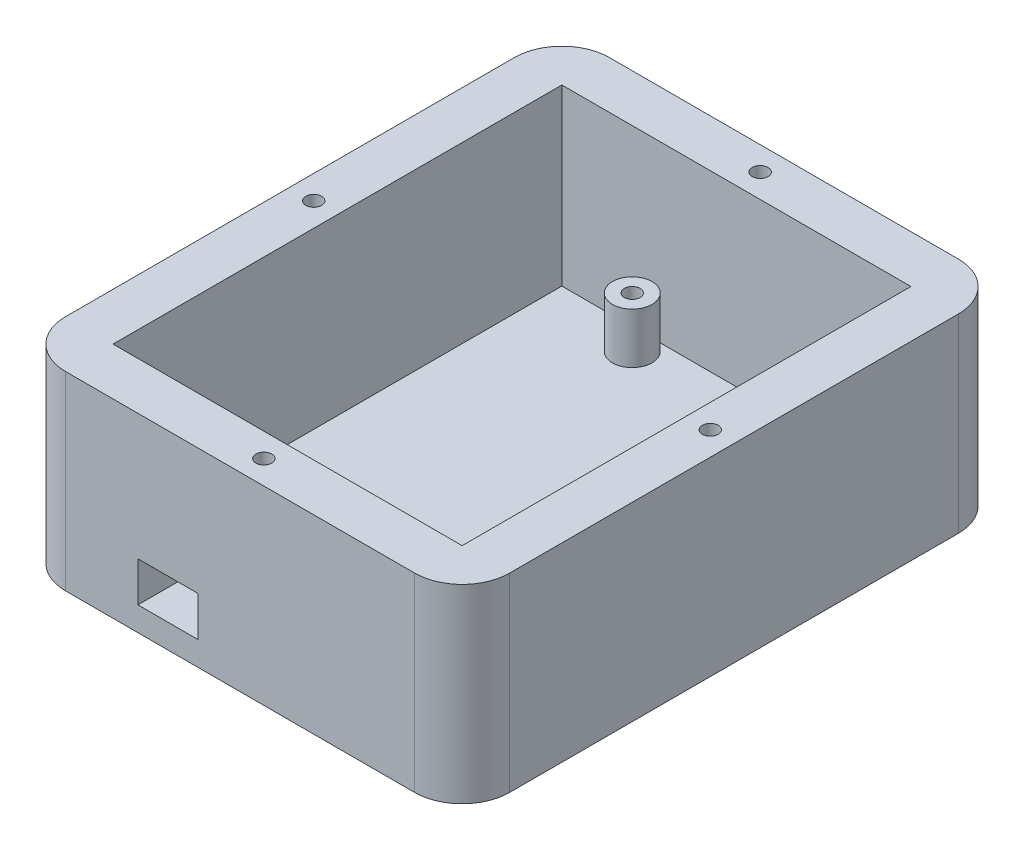
ISO-10303-21;
HEADER;
FILE_DESCRIPTION(('STEP AP214'),'2;1');
FILE_NAME('part.step','',(''),(''),'','','');
FILE_SCHEMA(('AUTOMOTIVE_DESIGN { 1 0 10303 214 1 1 1 1 }'));
ENDSEC;
DATA;
#1=APPLICATION_CONTEXT('core data for automotive mechanical design processes');
#2=APPLICATION_PROTOCOL_DEFINITION('international standard','automotive_design',2000,#1);
#3=PRODUCT_CONTEXT('',#1,'mechanical');
#4=PRODUCT('Part','Part','',(#3));
#5=PRODUCT_RELATED_PRODUCT_CATEGORY('part','',(#4));
#6=PRODUCT_DEFINITION_FORMATION('','',#4);
#7=PRODUCT_DEFINITION_CONTEXT('part definition',#1,'design');
#8=PRODUCT_DEFINITION('design','',#6,#7);
#9=PRODUCT_DEFINITION_SHAPE('','',#8);
#10=(LENGTH_UNIT() NAMED_UNIT(*) SI_UNIT(.MILLI.,.METRE.));
#11=(NAMED_UNIT(*) PLANE_ANGLE_UNIT() SI_UNIT($,.RADIAN.));
#12=(NAMED_UNIT(*) SI_UNIT($,.STERADIAN.) SOLID_ANGLE_UNIT());
#13=UNCERTAINTY_MEASURE_WITH_UNIT(LENGTH_MEASURE(1.E-05),#10,'distance_accuracy_value','');
#14=(GEOMETRIC_REPRESENTATION_CONTEXT(3) GLOBAL_UNCERTAINTY_ASSIGNED_CONTEXT((#13)) GLOBAL_UNIT_ASSIGNED_CONTEXT((#10,
#11,#12)) REPRESENTATION_CONTEXT('',''));
#15=CARTESIAN_POINT('',(0.,0.,0.));
#16=DIRECTION('',(0.,0.,1.));
#17=DIRECTION('',(1.,0.,0.));
#18=AXIS2_PLACEMENT_3D('',#15,#16,#17);
#19=CARTESIAN_POINT('',(3.175,38.1,-3.175));
#20=DIRECTION('',(0.,-1.,0.));
#21=DIRECTION('',(0.,0.,-1.));
#22=AXIS2_PLACEMENT_3D('',#19,#20,#21);
#23=PLANE('',#22);
#24=CARTESIAN_POINT('',(-1.5875,38.1,-48.175000043));
#25=DIRECTION('',(0.,1.,0.));
#26=DIRECTION('',(0.,0.,1.));
#27=AXIS2_PLACEMENT_3D('',#24,#25,#26);
#28=CIRCLE('',#27,1.5875);
#29=CARTESIAN_POINT('',(-1.5875,38.1,-46.587500043));
#30=VERTEX_POINT('',#29);
#31=EDGE_CURVE('E184',#30,#30,#28,.T.);
#32=ORIENTED_EDGE('',*,*,#31,.F.);
#33=EDGE_LOOP('',(#32));
#34=FACE_BOUND('',#33,.T.);
#35=CARTESIAN_POINT('',(38.174999977,38.1,-97.937500086));
#36=DIRECTION('',(0.,1.,0.));
#37=DIRECTION('',(0.,0.,1.));
#38=AXIS2_PLACEMENT_3D('',#35,#36,#37);
#39=CIRCLE('',#38,1.5875);
#40=CARTESIAN_POINT('',(38.174999977,38.1,-96.350000086));
#41=VERTEX_POINT('',#40);
#42=EDGE_CURVE('E190',#41,#41,#39,.T.);
#43=ORIENTED_EDGE('',*,*,#42,.F.);
#44=EDGE_LOOP('',(#43));
#45=FACE_BOUND('',#44,.T.);
#46=CARTESIAN_POINT('',(38.174999977,38.1,1.58750000000001));
#47=DIRECTION('',(0.,1.,0.));
#48=DIRECTION('',(0.,0.,-1.));
#49=AXIS2_PLACEMENT_3D('',#46,#47,#48);
#50=CIRCLE('',#49,1.5875);
#51=CARTESIAN_POINT('',(38.174999977,38.1,0.));
#52=VERTEX_POINT('',#51);
#53=EDGE_CURVE('E196',#52,#52,#50,.T.);
#54=ORIENTED_EDGE('',*,*,#53,.F.);
#55=EDGE_LOOP('',(#54));
#56=FACE_BOUND('',#55,.T.);
#57=CARTESIAN_POINT('',(77.937499954,38.1,-48.175000043));
#58=DIRECTION('',(0.,1.,0.));
#59=DIRECTION('',(0.,0.,-1.));
#60=AXIS2_PLACEMENT_3D('',#57,#58,#59);
#61=CIRCLE('',#60,1.5875);
#62=CARTESIAN_POINT('',(77.937499954,38.1,-49.762500043));
#63=VERTEX_POINT('',#62);
#64=EDGE_CURVE('E178',#63,#63,#61,.T.);
#65=ORIENTED_EDGE('',*,*,#64,.F.);
#66=EDGE_LOOP('',(#65));
#67=FACE_BOUND('',#66,.T.);
#68=DIRECTION('',(0.,0.,-1.));
#69=VECTOR('',#68,1.);
#70=CARTESIAN_POINT('',(73.174999954,38.1,-3.175));
#71=LINE('',#70,#69);
#72=CARTESIAN_POINT('',(73.174999954,38.1,-3.175));
#73=VERTEX_POINT('',#72);
#74=CARTESIAN_POINT('',(73.174999954,38.1,-93.175000086));
#75=VERTEX_POINT('',#74);
#76=EDGE_CURVE('E281',#73,#75,#71,.T.);
#77=ORIENTED_EDGE('',*,*,#76,.F.);
#78=DIRECTION('',(1.,0.,0.));
#79=VECTOR('',#78,1.);
#80=CARTESIAN_POINT('',(3.175,38.1,-3.175));
#81=LINE('',#80,#79);
#82=CARTESIAN_POINT('',(3.175,38.1,-3.175));
#83=VERTEX_POINT('',#82);
#84=EDGE_CURVE('E284',#83,#73,#81,.T.);
#85=ORIENTED_EDGE('',*,*,#84,.F.);
#86=DIRECTION('',(0.,0.,1.));
#87=VECTOR('',#86,1.);
#88=CARTESIAN_POINT('',(3.175,38.1,-93.175000086));
#89=LINE('',#88,#87);
#90=CARTESIAN_POINT('',(3.175,38.1,-93.175000086));
#91=VERTEX_POINT('',#90);
#92=EDGE_CURVE('E277',#91,#83,#89,.T.);
#93=ORIENTED_EDGE('',*,*,#92,.F.);
#94=DIRECTION('',(-1.,0.,0.));
#95=VECTOR('',#94,1.);
#96=CARTESIAN_POINT('',(73.174999954,38.1,-93.175000086));
#97=LINE('',#96,#95);
#98=EDGE_CURVE('E278',#75,#91,#97,.T.);
#99=ORIENTED_EDGE('',*,*,#98,.F.);
#100=EDGE_LOOP('',(#77,#85,#93,#99));
#101=FACE_BOUND('',#100,.T.);
#102=CARTESIAN_POINT('',(3.175,38.1,-3.175));
#103=DIRECTION('',(0.,-1.,0.));
#104=DIRECTION('',(0.,0.,-1.));
#105=AXIS2_PLACEMENT_3D('',#102,#103,#104);
#106=CIRCLE('',#105,9.525);
#107=CARTESIAN_POINT('',(-6.35,38.1,-3.17500000000007));
#108=VERTEX_POINT('',#107);
#109=CARTESIAN_POINT('',(3.17500000000007,38.1,6.35));
#110=VERTEX_POINT('',#109);
#111=EDGE_CURVE('E207',#108,#110,#106,.F.);
#112=ORIENTED_EDGE('',*,*,#111,.T.);
#113=DIRECTION('',(1.,0.,0.));
#114=VECTOR('',#113,1.);
#115=CARTESIAN_POINT('',(73.1749999539999,38.1,6.35));
#116=LINE('',#115,#114);
#117=CARTESIAN_POINT('',(73.1749999539999,38.1,6.35));
#118=VERTEX_POINT('',#117);
#119=EDGE_CURVE('E219',#110,#118,#116,.T.);
#120=ORIENTED_EDGE('',*,*,#119,.T.);
#121=CARTESIAN_POINT('',(73.174999954,38.1,-3.175));
#122=DIRECTION('',(0.,-1.,0.));
#123=DIRECTION('',(0.,0.,-1.));
#124=AXIS2_PLACEMENT_3D('',#121,#122,#123);
#125=CIRCLE('',#124,9.525);
#126=CARTESIAN_POINT('',(82.699999954,38.1,-3.17500000000003));
#127=VERTEX_POINT('',#126);
#128=EDGE_CURVE('E217',#118,#127,#125,.F.);
#129=ORIENTED_EDGE('',*,*,#128,.T.);
#130=DIRECTION('',(0.,0.,-1.));
#131=VECTOR('',#130,1.);
#132=CARTESIAN_POINT('',(82.699999954,38.1,-93.1750000859999));
#133=LINE('',#132,#131);
#134=CARTESIAN_POINT('',(82.699999954,38.1,-93.1750000859999));
#135=VERTEX_POINT('',#134);
#136=EDGE_CURVE('E215',#127,#135,#133,.T.);
#137=ORIENTED_EDGE('',*,*,#136,.T.);
#138=CARTESIAN_POINT('',(73.174999954,38.1,-93.175000086));
#139=DIRECTION('',(0.,-1.,0.));
#140=DIRECTION('',(0.,0.,-1.));
#141=AXIS2_PLACEMENT_3D('',#138,#139,#140);
#142=CIRCLE('',#141,9.52499999999999);
#143=CARTESIAN_POINT('',(73.174999954,38.1,-102.700000086));
#144=VERTEX_POINT('',#143);
#145=EDGE_CURVE('E213',#135,#144,#142,.F.);
#146=ORIENTED_EDGE('',*,*,#145,.T.);
#147=DIRECTION('',(-1.,0.,0.));
#148=VECTOR('',#147,1.);
#149=CARTESIAN_POINT('',(3.17500000000007,38.1,-102.700000086));
#150=LINE('',#149,#148);
#151=CARTESIAN_POINT('',(3.175,38.1,-102.700000086));
#152=VERTEX_POINT('',#151);
#153=EDGE_CURVE('E210',#144,#152,#150,.T.);
#154=ORIENTED_EDGE('',*,*,#153,.T.);
#155=CARTESIAN_POINT('',(3.175,38.1,-93.175000086));
#156=DIRECTION('',(0.,-1.,0.));
#157=DIRECTION('',(0.,0.,-1.));
#158=AXIS2_PLACEMENT_3D('',#155,#156,#157);
#159=CIRCLE('',#158,9.525);
#160=CARTESIAN_POINT('',(-6.35,38.1,-93.175000086));
#161=VERTEX_POINT('',#160);
#162=EDGE_CURVE('E208',#152,#161,#159,.F.);
#163=ORIENTED_EDGE('',*,*,#162,.T.);
#164=DIRECTION('',(0.,0.,1.));
#165=VECTOR('',#164,1.);
#166=CARTESIAN_POINT('',(-6.35,38.1,-3.17500000000007));
#167=LINE('',#166,#165);
#168=EDGE_CURVE('E204',#161,#108,#167,.T.);
#169=ORIENTED_EDGE('',*,*,#168,.T.);
#170=EDGE_LOOP('',(#112,#120,#129,#137,#146,#154,#163,#169));
#171=FACE_BOUND('',#170,.T.);
#172=ADVANCED_FACE('F35',(#34,#45,#56,#67,#101,#171),#23,.F.);
#173=CARTESIAN_POINT('',(3.175,3.175,-3.175));
#174=DIRECTION('',(0.,-1.,0.));
#175=DIRECTION('',(0.,0.,-1.));
#176=AXIS2_PLACEMENT_3D('',#173,#174,#175);
#177=PLANE('',#176);
#178=CARTESIAN_POINT('',(39.987999977,3.175,-9.17500004299999));
#179=DIRECTION('',(0.,-1.,0.));
#180=DIRECTION('',(0.,0.,-1.));
#181=AXIS2_PLACEMENT_3D('',#178,#179,#180);
#182=CIRCLE('',#181,3.96875);
#183=CARTESIAN_POINT('',(39.987999977,3.175,-13.143750043));
#184=VERTEX_POINT('',#183);
#185=EDGE_CURVE('E12',#184,#184,#182,.F.);
#186=ORIENTED_EDGE('',*,*,#185,.F.);
#187=EDGE_LOOP('',(#186));
#188=FACE_BOUND('',#187,.T.);
#189=CARTESIAN_POINT('',(21.587999977,3.175,-88.875000043));
#190=DIRECTION('',(0.,-1.,0.));
#191=DIRECTION('',(0.,0.,-1.));
#192=AXIS2_PLACEMENT_3D('',#189,#190,#191);
#193=CIRCLE('',#192,3.96875);
#194=CARTESIAN_POINT('',(21.587999977,3.175,-92.843750043));
#195=VERTEX_POINT('',#194);
#196=EDGE_CURVE('E43',#195,#195,#193,.F.);
#197=ORIENTED_EDGE('',*,*,#196,.F.);
#198=EDGE_LOOP('',(#197));
#199=FACE_BOUND('',#198,.T.);
#200=DIRECTION('',(0.,0.,1.));
#201=VECTOR('',#200,1.);
#202=CARTESIAN_POINT('',(3.175,3.175,-93.175000086));
#203=LINE('',#202,#201);
#204=CARTESIAN_POINT('',(3.175,3.175,-93.175000086));
#205=VERTEX_POINT('',#204);
#206=CARTESIAN_POINT('',(3.175,3.175,-3.175));
#207=VERTEX_POINT('',#206);
#208=EDGE_CURVE('E292',#205,#207,#203,.T.);
#209=ORIENTED_EDGE('',*,*,#208,.T.);
#210=DIRECTION('',(1.,0.,0.));
#211=VECTOR('',#210,1.);
#212=CARTESIAN_POINT('',(3.175,3.175,-3.175));
#213=LINE('',#212,#211);
#214=CARTESIAN_POINT('',(73.174999954,3.175,-3.175));
#215=VERTEX_POINT('',#214);
#216=EDGE_CURVE('E280',#207,#215,#213,.T.);
#217=ORIENTED_EDGE('',*,*,#216,.T.);
#218=DIRECTION('',(0.,0.,-1.));
#219=VECTOR('',#218,1.);
#220=CARTESIAN_POINT('',(73.174999954,3.175,-3.175));
#221=LINE('',#220,#219);
#222=CARTESIAN_POINT('',(73.174999954,3.175,-93.175000086));
#223=VERTEX_POINT('',#222);
#224=EDGE_CURVE('E301',#215,#223,#221,.T.);
#225=ORIENTED_EDGE('',*,*,#224,.T.);
#226=DIRECTION('',(-1.,0.,0.));
#227=VECTOR('',#226,1.);
#228=CARTESIAN_POINT('',(73.174999954,3.175,-93.175000086));
#229=LINE('',#228,#227);
#230=EDGE_CURVE('E297',#223,#205,#229,.T.);
#231=ORIENTED_EDGE('',*,*,#230,.T.);
#232=EDGE_LOOP('',(#209,#217,#225,#231));
#233=FACE_BOUND('',#232,.T.);
#234=ADVANCED_FACE('F313',(#188,#199,#233),#177,.F.);
#235=CARTESIAN_POINT('',(3.175,-114.017542549557,-3.175));
#236=DIRECTION('',(0.,0.,1.));
#237=DIRECTION('',(1.,0.,0.));
#238=AXIS2_PLACEMENT_3D('',#235,#236,#237);
#239=PLANE('',#238);
#240=DIRECTION('',(1.,0.,0.));
#241=VECTOR('',#240,1.);
#242=CARTESIAN_POINT('',(17.687999977,12.835,-3.175));
#243=LINE('',#242,#241);
#244=CARTESIAN_POINT('',(17.687999977,12.835,-3.175));
#245=VERTEX_POINT('',#244);
#246=CARTESIAN_POINT('',(29.687999977,12.835,-3.175));
#247=VERTEX_POINT('',#246);
#248=EDGE_CURVE('E426',#245,#247,#243,.T.);
#249=ORIENTED_EDGE('',*,*,#248,.F.);
#250=DIRECTION('',(0.,1.,0.));
#251=VECTOR('',#250,1.);
#252=CARTESIAN_POINT('',(17.687999977,12.835,-3.175));
#253=LINE('',#252,#251);
#254=CARTESIAN_POINT('',(17.687999977,4.835,-3.175));
#255=VERTEX_POINT('',#254);
#256=EDGE_CURVE('E179',#255,#245,#253,.T.);
#257=ORIENTED_EDGE('',*,*,#256,.F.);
#258=DIRECTION('',(-1.,0.,0.));
#259=VECTOR('',#258,1.);
#260=CARTESIAN_POINT('',(17.687999977,4.835,-3.175));
#261=LINE('',#260,#259);
#262=CARTESIAN_POINT('',(29.687999977,4.835,-3.175));
#263=VERTEX_POINT('',#262);
#264=EDGE_CURVE('E176',#263,#255,#261,.T.);
#265=ORIENTED_EDGE('',*,*,#264,.F.);
#266=DIRECTION('',(0.,-1.,0.));
#267=VECTOR('',#266,1.);
#268=CARTESIAN_POINT('',(29.687999977,12.835,-3.175));
#269=LINE('',#268,#267);
#270=EDGE_CURVE('E154',#247,#263,#269,.T.);
#271=ORIENTED_EDGE('',*,*,#270,.F.);
#272=EDGE_LOOP('',(#249,#257,#265,#271));
#273=FACE_BOUND('',#272,.T.);
#274=DIRECTION('',(0.,1.,0.));
#275=VECTOR('',#274,1.);
#276=CARTESIAN_POINT('',(3.175,-114.017542549557,-3.175));
#277=LINE('',#276,#275);
#278=EDGE_CURVE('E295',#207,#83,#277,.T.);
#279=ORIENTED_EDGE('',*,*,#278,.T.);
#280=ORIENTED_EDGE('',*,*,#84,.T.);
#281=DIRECTION('',(0.,1.,0.));
#282=VECTOR('',#281,1.);
#283=CARTESIAN_POINT('',(73.174999954,-114.017542549557,-3.175));
#284=LINE('',#283,#282);
#285=EDGE_CURVE('E291',#215,#73,#284,.T.);
#286=ORIENTED_EDGE('',*,*,#285,.F.);
#287=ORIENTED_EDGE('',*,*,#216,.F.);
#288=EDGE_LOOP('',(#279,#280,#286,#287));
#289=FACE_BOUND('',#288,.T.);
#290=ADVANCED_FACE('F316',(#273,#289),#239,.F.);
#291=CARTESIAN_POINT('',(73.174999954,-114.017542549557,-3.175));
#292=DIRECTION('',(1.,0.,0.));
#293=DIRECTION('',(0.,0.,-1.));
#294=AXIS2_PLACEMENT_3D('',#291,#292,#293);
#295=PLANE('',#294);
#296=ORIENTED_EDGE('',*,*,#285,.T.);
#297=ORIENTED_EDGE('',*,*,#76,.T.);
#298=DIRECTION('',(0.,1.,0.));
#299=VECTOR('',#298,1.);
#300=CARTESIAN_POINT('',(73.174999954,-114.017542549557,-93.175000086));
#301=LINE('',#300,#299);
#302=EDGE_CURVE('E300',#223,#75,#301,.T.);
#303=ORIENTED_EDGE('',*,*,#302,.F.);
#304=ORIENTED_EDGE('',*,*,#224,.F.);
#305=EDGE_LOOP('',(#296,#297,#303,#304));
#306=FACE_BOUND('',#305,.T.);
#307=ADVANCED_FACE('F331',(#306),#295,.F.);
#308=CARTESIAN_POINT('',(73.174999954,-114.017542549557,-93.175000086));
#309=DIRECTION('',(0.,0.,-1.));
#310=DIRECTION('',(-1.,0.,0.));
#311=AXIS2_PLACEMENT_3D('',#308,#309,#310);
#312=PLANE('',#311);
#313=ORIENTED_EDGE('',*,*,#302,.T.);
#314=ORIENTED_EDGE('',*,*,#98,.T.);
#315=DIRECTION('',(0.,1.,0.));
#316=VECTOR('',#315,1.);
#317=CARTESIAN_POINT('',(3.175,-114.017542549557,-93.175000086));
#318=LINE('',#317,#316);
#319=EDGE_CURVE('E296',#205,#91,#318,.T.);
#320=ORIENTED_EDGE('',*,*,#319,.F.);
#321=ORIENTED_EDGE('',*,*,#230,.F.);
#322=EDGE_LOOP('',(#313,#314,#320,#321));
#323=FACE_BOUND('',#322,.T.);
#324=ADVANCED_FACE('F335',(#323),#312,.F.);
#325=CARTESIAN_POINT('',(3.175,-114.017542549557,-93.175000086));
#326=DIRECTION('',(-1.,0.,0.));
#327=DIRECTION('',(0.,0.,1.));
#328=AXIS2_PLACEMENT_3D('',#325,#326,#327);
#329=PLANE('',#328);
#330=ORIENTED_EDGE('',*,*,#319,.T.);
#331=ORIENTED_EDGE('',*,*,#92,.T.);
#332=ORIENTED_EDGE('',*,*,#278,.F.);
#333=ORIENTED_EDGE('',*,*,#208,.F.);
#334=EDGE_LOOP('',(#330,#331,#332,#333));
#335=FACE_BOUND('',#334,.T.);
#336=ADVANCED_FACE('F324',(#335),#329,.F.);
#337=CARTESIAN_POINT('',(21.587999977,13.335,-88.875000043));
#338=DIRECTION('',(0.,1.,0.));
#339=DIRECTION('',(0.,0.,1.));
#340=AXIS2_PLACEMENT_3D('',#337,#338,#339);
#341=PLANE('',#340);
#342=CARTESIAN_POINT('',(21.587999977,13.335,-88.875000043));
#343=DIRECTION('',(0.,1.,0.));
#344=DIRECTION('',(0.,0.,1.));
#345=AXIS2_PLACEMENT_3D('',#342,#343,#344);
#346=CIRCLE('',#345,3.96875);
#347=CARTESIAN_POINT('',(21.587999977,13.335,-84.906250043));
#348=VERTEX_POINT('',#347);
#349=EDGE_CURVE('E272',#348,#348,#346,.T.);
#350=ORIENTED_EDGE('',*,*,#349,.T.);
#351=EDGE_LOOP('',(#350));
#352=FACE_BOUND('',#351,.T.);
#353=CARTESIAN_POINT('',(21.587999977,13.335,-88.875000043));
#354=DIRECTION('',(0.,1.,0.));
#355=DIRECTION('',(0.,0.,1.));
#356=AXIS2_PLACEMENT_3D('',#353,#354,#355);
#357=CIRCLE('',#356,1.5875);
#358=CARTESIAN_POINT('',(21.587999977,13.335,-87.287500043));
#359=VERTEX_POINT('',#358);
#360=EDGE_CURVE('E269',#359,#359,#357,.T.);
#361=ORIENTED_EDGE('',*,*,#360,.F.);
#362=EDGE_LOOP('',(#361));
#363=FACE_BOUND('',#362,.T.);
#364=ADVANCED_FACE('F407',(#352,#363),#341,.T.);
#365=CARTESIAN_POINT('',(21.587999977,13.335,-88.875000043));
#366=DIRECTION('',(0.,-1.,0.));
#367=DIRECTION('',(0.,0.,-1.));
#368=AXIS2_PLACEMENT_3D('',#365,#366,#367);
#369=CYLINDRICAL_SURFACE('',#368,3.96875);
#370=ORIENTED_EDGE('',*,*,#349,.F.);
#371=EDGE_LOOP('',(#370));
#372=FACE_BOUND('',#371,.T.);
#373=ORIENTED_EDGE('',*,*,#196,.T.);
#374=EDGE_LOOP('',(#373));
#375=FACE_BOUND('',#374,.T.);
#376=ADVANCED_FACE('F311',(#372,#375),#369,.T.);
#377=CARTESIAN_POINT('',(21.587999977,13.335,-88.875000043));
#378=DIRECTION('',(0.,-1.,0.));
#379=DIRECTION('',(0.,0.,-1.));
#380=AXIS2_PLACEMENT_3D('',#377,#378,#379);
#381=CYLINDRICAL_SURFACE('',#380,1.5875);
#382=ORIENTED_EDGE('',*,*,#360,.T.);
#383=EDGE_LOOP('',(#382));
#384=FACE_BOUND('',#383,.T.);
#385=CARTESIAN_POINT('',(21.587999977,3.175,-88.875000043));
#386=DIRECTION('',(0.,1.,0.));
#387=DIRECTION('',(0.,0.,1.));
#388=AXIS2_PLACEMENT_3D('',#385,#386,#387);
#389=CIRCLE('',#388,1.5875);
#390=CARTESIAN_POINT('',(21.587999977,3.175,-87.287500043));
#391=VERTEX_POINT('',#390);
#392=EDGE_CURVE('E268',#391,#391,#389,.T.);
#393=ORIENTED_EDGE('',*,*,#392,.F.);
#394=EDGE_LOOP('',(#393));
#395=FACE_BOUND('',#394,.T.);
#396=ADVANCED_FACE('F403',(#384,#395),#381,.F.);
#397=ORIENTED_EDGE('',*,*,#392,.T.);
#398=EDGE_LOOP('',(#397));
#399=FACE_BOUND('',#398,.T.);
#400=ADVANCED_FACE('F320',(#399),#177,.F.);
#401=CARTESIAN_POINT('',(39.987999977,13.335,-9.17500004299999));
#402=DIRECTION('',(0.,1.,0.));
#403=DIRECTION('',(0.,0.,1.));
#404=AXIS2_PLACEMENT_3D('',#401,#402,#403);
#405=PLANE('',#404);
#406=CARTESIAN_POINT('',(39.987999977,13.335,-9.17500004299999));
#407=DIRECTION('',(0.,1.,0.));
#408=DIRECTION('',(0.,0.,1.));
#409=AXIS2_PLACEMENT_3D('',#406,#407,#408);
#410=CIRCLE('',#409,3.96875);
#411=CARTESIAN_POINT('',(39.987999977,13.335,-5.206250043));
#412=VERTEX_POINT('',#411);
#413=EDGE_CURVE('E263',#412,#412,#410,.T.);
#414=ORIENTED_EDGE('',*,*,#413,.T.);
#415=EDGE_LOOP('',(#414));
#416=FACE_BOUND('',#415,.T.);
#417=CARTESIAN_POINT('',(39.987999977,13.335,-9.17500004299999));
#418=DIRECTION('',(0.,1.,0.));
#419=DIRECTION('',(0.,0.,1.));
#420=AXIS2_PLACEMENT_3D('',#417,#418,#419);
#421=CIRCLE('',#420,1.5875);
#422=CARTESIAN_POINT('',(39.987999977,13.335,-7.587500043));
#423=VERTEX_POINT('',#422);
#424=EDGE_CURVE('E260',#423,#423,#421,.T.);
#425=ORIENTED_EDGE('',*,*,#424,.F.);
#426=EDGE_LOOP('',(#425));
#427=FACE_BOUND('',#426,.T.);
#428=ADVANCED_FACE('F396',(#416,#427),#405,.T.);
#429=CARTESIAN_POINT('',(39.987999977,13.335,-9.17500004299999));
#430=DIRECTION('',(0.,-1.,0.));
#431=DIRECTION('',(0.,0.,-1.));
#432=AXIS2_PLACEMENT_3D('',#429,#430,#431);
#433=CYLINDRICAL_SURFACE('',#432,3.96875);
#434=ORIENTED_EDGE('',*,*,#413,.F.);
#435=EDGE_LOOP('',(#434));
#436=FACE_BOUND('',#435,.T.);
#437=ORIENTED_EDGE('',*,*,#185,.T.);
#438=EDGE_LOOP('',(#437));
#439=FACE_BOUND('',#438,.T.);
#440=ADVANCED_FACE('F394',(#436,#439),#433,.T.);
#441=CARTESIAN_POINT('',(39.987999977,13.335,-9.17500004299999));
#442=DIRECTION('',(0.,-1.,0.));
#443=DIRECTION('',(0.,0.,-1.));
#444=AXIS2_PLACEMENT_3D('',#441,#442,#443);
#445=CYLINDRICAL_SURFACE('',#444,1.5875);
#446=ORIENTED_EDGE('',*,*,#424,.T.);
#447=EDGE_LOOP('',(#446));
#448=FACE_BOUND('',#447,.T.);
#449=CARTESIAN_POINT('',(39.987999977,3.175,-9.17500004299999));
#450=DIRECTION('',(0.,1.,0.));
#451=DIRECTION('',(0.,0.,1.));
#452=AXIS2_PLACEMENT_3D('',#449,#450,#451);
#453=CIRCLE('',#452,1.5875);
#454=CARTESIAN_POINT('',(39.987999977,3.175,-7.587500043));
#455=VERTEX_POINT('',#454);
#456=EDGE_CURVE('E206',#455,#455,#453,.T.);
#457=ORIENTED_EDGE('',*,*,#456,.F.);
#458=EDGE_LOOP('',(#457));
#459=FACE_BOUND('',#458,.T.);
#460=ADVANCED_FACE('F386',(#448,#459),#445,.F.);
#461=ORIENTED_EDGE('',*,*,#456,.T.);
#462=EDGE_LOOP('',(#461));
#463=FACE_BOUND('',#462,.T.);
#464=ADVANCED_FACE('F319',(#463),#177,.F.);
#465=CARTESIAN_POINT('',(-6.35,178.889932205978,-3.17500000000007));
#466=DIRECTION('',(-1.,0.,0.));
#467=DIRECTION('',(0.,0.,1.));
#468=AXIS2_PLACEMENT_3D('',#465,#466,#467);
#469=PLANE('',#468);
#470=ORIENTED_EDGE('',*,*,#168,.F.);
#471=DIRECTION('',(0.,-1.,0.));
#472=VECTOR('',#471,1.);
#473=CARTESIAN_POINT('',(-6.35,178.889932205978,-93.175000086));
#474=LINE('',#473,#472);
#475=CARTESIAN_POINT('',(-6.35,0.,-93.175000086));
#476=VERTEX_POINT('',#475);
#477=EDGE_CURVE('E257',#161,#476,#474,.T.);
#478=ORIENTED_EDGE('',*,*,#477,.T.);
#479=DIRECTION('',(0.,0.,-1.));
#480=VECTOR('',#479,1.);
#481=CARTESIAN_POINT('',(-6.35,0.,-3.17500000000007));
#482=LINE('',#481,#480);
#483=CARTESIAN_POINT('',(-6.35,0.,-3.17500000000007));
#484=VERTEX_POINT('',#483);
#485=EDGE_CURVE('E224',#484,#476,#482,.T.);
#486=ORIENTED_EDGE('',*,*,#485,.F.);
#487=DIRECTION('',(0.,-1.,0.));
#488=VECTOR('',#487,1.);
#489=CARTESIAN_POINT('',(-6.35,178.889932205978,-3.17500000000007));
#490=LINE('',#489,#488);
#491=EDGE_CURVE('E245',#108,#484,#490,.T.);
#492=ORIENTED_EDGE('',*,*,#491,.F.);
#493=EDGE_LOOP('',(#470,#478,#486,#492));
#494=FACE_BOUND('',#493,.T.);
#495=ADVANCED_FACE('F378',(#494),#469,.T.);
#496=CARTESIAN_POINT('',(3.175,178.889932205978,-93.175000086));
#497=DIRECTION('',(0.,-1.,0.));
#498=DIRECTION('',(0.,0.,-1.));
#499=AXIS2_PLACEMENT_3D('',#496,#497,#498);
#500=CYLINDRICAL_SURFACE('',#499,9.525);
#501=ORIENTED_EDGE('',*,*,#162,.F.);
#502=DIRECTION('',(0.,-1.,0.));
#503=VECTOR('',#502,1.);
#504=CARTESIAN_POINT('',(3.17500000000007,178.889932205978,-102.700000086));
#505=LINE('',#504,#503);
#506=CARTESIAN_POINT('',(3.17500000000007,0.,-102.700000086));
#507=VERTEX_POINT('',#506);
#508=EDGE_CURVE('E255',#152,#507,#505,.T.);
#509=ORIENTED_EDGE('',*,*,#508,.T.);
#510=CARTESIAN_POINT('',(3.175,0.,-93.175000086));
#511=DIRECTION('',(0.,-1.,0.));
#512=DIRECTION('',(0.,0.,-1.));
#513=AXIS2_PLACEMENT_3D('',#510,#511,#512);
#514=CIRCLE('',#513,9.525);
#515=EDGE_CURVE('E227',#476,#507,#514,.T.);
#516=ORIENTED_EDGE('',*,*,#515,.F.);
#517=ORIENTED_EDGE('',*,*,#477,.F.);
#518=EDGE_LOOP('',(#501,#509,#516,#517));
#519=FACE_BOUND('',#518,.T.);
#520=ADVANCED_FACE('F375',(#519),#500,.T.);
#521=CARTESIAN_POINT('',(3.17500000000007,178.889932205978,-102.700000086));
#522=DIRECTION('',(0.,0.,-1.));
#523=DIRECTION('',(-1.,0.,0.));
#524=AXIS2_PLACEMENT_3D('',#521,#522,#523);
#525=PLANE('',#524);
#526=ORIENTED_EDGE('',*,*,#153,.F.);
#527=DIRECTION('',(0.,-1.,0.));
#528=VECTOR('',#527,1.);
#529=CARTESIAN_POINT('',(73.174999954,178.889932205978,-102.700000086));
#530=LINE('',#529,#528);
#531=CARTESIAN_POINT('',(73.174999954,0.,-102.700000086));
#532=VERTEX_POINT('',#531);
#533=EDGE_CURVE('E253',#144,#532,#530,.T.);
#534=ORIENTED_EDGE('',*,*,#533,.T.);
#535=DIRECTION('',(1.,0.,0.));
#536=VECTOR('',#535,1.);
#537=CARTESIAN_POINT('',(3.17500000000007,0.,-102.700000086));
#538=LINE('',#537,#536);
#539=EDGE_CURVE('E230',#507,#532,#538,.T.);
#540=ORIENTED_EDGE('',*,*,#539,.F.);
#541=ORIENTED_EDGE('',*,*,#508,.F.);
#542=EDGE_LOOP('',(#526,#534,#540,#541));
#543=FACE_BOUND('',#542,.T.);
#544=ADVANCED_FACE('F371',(#543),#525,.T.);
#545=CARTESIAN_POINT('',(73.174999954,178.889932205978,-93.175000086));
#546=DIRECTION('',(0.,-1.,0.));
#547=DIRECTION('',(0.,0.,-1.));
#548=AXIS2_PLACEMENT_3D('',#545,#546,#547);
#549=CYLINDRICAL_SURFACE('',#548,9.52499999999999);
#550=ORIENTED_EDGE('',*,*,#145,.F.);
#551=DIRECTION('',(0.,-1.,0.));
#552=VECTOR('',#551,1.);
#553=CARTESIAN_POINT('',(82.699999954,178.889932205978,-93.1750000859999));
#554=LINE('',#553,#552);
#555=CARTESIAN_POINT('',(82.699999954,0.,-93.1750000859999));
#556=VERTEX_POINT('',#555);
#557=EDGE_CURVE('E251',#135,#556,#554,.T.);
#558=ORIENTED_EDGE('',*,*,#557,.T.);
#559=CARTESIAN_POINT('',(73.174999954,0.,-93.175000086));
#560=DIRECTION('',(0.,-1.,0.));
#561=DIRECTION('',(0.,0.,-1.));
#562=AXIS2_PLACEMENT_3D('',#559,#560,#561);
#563=CIRCLE('',#562,9.52499999999999);
#564=EDGE_CURVE('E233',#532,#556,#563,.T.);
#565=ORIENTED_EDGE('',*,*,#564,.F.);
#566=ORIENTED_EDGE('',*,*,#533,.F.);
#567=EDGE_LOOP('',(#550,#558,#565,#566));
#568=FACE_BOUND('',#567,.T.);
#569=ADVANCED_FACE('F365',(#568),#549,.T.);
#570=CARTESIAN_POINT('',(82.699999954,178.889932205978,-93.1750000859999));
#571=DIRECTION('',(1.,0.,0.));
#572=DIRECTION('',(0.,0.,-1.));
#573=AXIS2_PLACEMENT_3D('',#570,#571,#572);
#574=PLANE('',#573);
#575=ORIENTED_EDGE('',*,*,#136,.F.);
#576=DIRECTION('',(0.,-1.,0.));
#577=VECTOR('',#576,1.);
#578=CARTESIAN_POINT('',(82.699999954,178.889932205978,-3.17500000000003));
#579=LINE('',#578,#577);
#580=CARTESIAN_POINT('',(82.699999954,0.,-3.17500000000003));
#581=VERTEX_POINT('',#580);
#582=EDGE_CURVE('E249',#127,#581,#579,.T.);
#583=ORIENTED_EDGE('',*,*,#582,.T.);
#584=DIRECTION('',(0.,0.,1.));
#585=VECTOR('',#584,1.);
#586=CARTESIAN_POINT('',(82.699999954,0.,-93.1750000859999));
#587=LINE('',#586,#585);
#588=EDGE_CURVE('E236',#556,#581,#587,.T.);
#589=ORIENTED_EDGE('',*,*,#588,.F.);
#590=ORIENTED_EDGE('',*,*,#557,.F.);
#591=EDGE_LOOP('',(#575,#583,#589,#590));
#592=FACE_BOUND('',#591,.T.);
#593=ADVANCED_FACE('F362',(#592),#574,.T.);
#594=CARTESIAN_POINT('',(73.174999954,178.889932205978,-3.175));
#595=DIRECTION('',(0.,-1.,0.));
#596=DIRECTION('',(0.,0.,-1.));
#597=AXIS2_PLACEMENT_3D('',#594,#595,#596);
#598=CYLINDRICAL_SURFACE('',#597,9.525);
#599=ORIENTED_EDGE('',*,*,#128,.F.);
#600=DIRECTION('',(0.,-1.,0.));
#601=VECTOR('',#600,1.);
#602=CARTESIAN_POINT('',(73.1749999539999,178.889932205978,6.35));
#603=LINE('',#602,#601);
#604=CARTESIAN_POINT('',(73.1749999539999,0.,6.35));
#605=VERTEX_POINT('',#604);
#606=EDGE_CURVE('E247',#118,#605,#603,.T.);
#607=ORIENTED_EDGE('',*,*,#606,.T.);
#608=CARTESIAN_POINT('',(73.174999954,0.,-3.175));
#609=DIRECTION('',(0.,-1.,0.));
#610=DIRECTION('',(0.,0.,-1.));
#611=AXIS2_PLACEMENT_3D('',#608,#609,#610);
#612=CIRCLE('',#611,9.525);
#613=EDGE_CURVE('E239',#581,#605,#612,.T.);
#614=ORIENTED_EDGE('',*,*,#613,.F.);
#615=ORIENTED_EDGE('',*,*,#582,.F.);
#616=EDGE_LOOP('',(#599,#607,#614,#615));
#617=FACE_BOUND('',#616,.T.);
#618=ADVANCED_FACE('F357',(#617),#598,.T.);
#619=CARTESIAN_POINT('',(73.1749999539999,178.889932205978,6.35));
#620=DIRECTION('',(0.,0.,1.));
#621=DIRECTION('',(1.,0.,0.));
#622=AXIS2_PLACEMENT_3D('',#619,#620,#621);
#623=PLANE('',#622);
#624=DIRECTION('',(0.,-1.,0.));
#625=VECTOR('',#624,1.);
#626=CARTESIAN_POINT('',(17.687999977,12.835,6.35));
#627=LINE('',#626,#625);
#628=CARTESIAN_POINT('',(17.687999977,12.835,6.35));
#629=VERTEX_POINT('',#628);
#630=CARTESIAN_POINT('',(17.687999977,4.83499999999999,6.35));
#631=VERTEX_POINT('',#630);
#632=EDGE_CURVE('E58',#629,#631,#627,.T.);
#633=ORIENTED_EDGE('',*,*,#632,.F.);
#634=DIRECTION('',(-1.,0.,0.));
#635=VECTOR('',#634,1.);
#636=CARTESIAN_POINT('',(17.687999977,12.835,6.35));
#637=LINE('',#636,#635);
#638=CARTESIAN_POINT('',(29.687999977,12.835,6.35));
#639=VERTEX_POINT('',#638);
#640=EDGE_CURVE('E167',#639,#629,#637,.T.);
#641=ORIENTED_EDGE('',*,*,#640,.F.);
#642=DIRECTION('',(0.,1.,0.));
#643=VECTOR('',#642,1.);
#644=CARTESIAN_POINT('',(29.687999977,12.835,6.35));
#645=LINE('',#644,#643);
#646=CARTESIAN_POINT('',(29.687999977,4.83500000000001,6.35));
#647=VERTEX_POINT('',#646);
#648=EDGE_CURVE('E151',#647,#639,#645,.T.);
#649=ORIENTED_EDGE('',*,*,#648,.F.);
#650=DIRECTION('',(1.,0.,0.));
#651=VECTOR('',#650,1.);
#652=CARTESIAN_POINT('',(17.687999977,4.835,6.35));
#653=LINE('',#652,#651);
#654=EDGE_CURVE('E160',#631,#647,#653,.T.);
#655=ORIENTED_EDGE('',*,*,#654,.F.);
#656=EDGE_LOOP('',(#633,#641,#649,#655));
#657=FACE_BOUND('',#656,.T.);
#658=ORIENTED_EDGE('',*,*,#119,.F.);
#659=DIRECTION('',(0.,-1.,0.));
#660=VECTOR('',#659,1.);
#661=CARTESIAN_POINT('',(3.17500000000007,178.889932205978,6.35));
#662=LINE('',#661,#660);
#663=CARTESIAN_POINT('',(3.17500000000007,0.,6.35));
#664=VERTEX_POINT('',#663);
#665=EDGE_CURVE('E211',#110,#664,#662,.T.);
#666=ORIENTED_EDGE('',*,*,#665,.T.);
#667=DIRECTION('',(-1.,0.,0.));
#668=VECTOR('',#667,1.);
#669=CARTESIAN_POINT('',(73.1749999539999,0.,6.35));
#670=LINE('',#669,#668);
#671=EDGE_CURVE('E242',#605,#664,#670,.T.);
#672=ORIENTED_EDGE('',*,*,#671,.F.);
#673=ORIENTED_EDGE('',*,*,#606,.F.);
#674=EDGE_LOOP('',(#658,#666,#672,#673));
#675=FACE_BOUND('',#674,.T.);
#676=ADVANCED_FACE('F164',(#657,#675),#623,.T.);
#677=CARTESIAN_POINT('',(3.175,178.889932205978,-3.175));
#678=DIRECTION('',(0.,-1.,0.));
#679=DIRECTION('',(0.,0.,-1.));
#680=AXIS2_PLACEMENT_3D('',#677,#678,#679);
#681=CYLINDRICAL_SURFACE('',#680,9.525);
#682=ORIENTED_EDGE('',*,*,#111,.F.);
#683=ORIENTED_EDGE('',*,*,#491,.T.);
#684=CARTESIAN_POINT('',(3.175,0.,-3.175));
#685=DIRECTION('',(0.,-1.,0.));
#686=DIRECTION('',(0.,0.,-1.));
#687=AXIS2_PLACEMENT_3D('',#684,#685,#686);
#688=CIRCLE('',#687,9.525);
#689=EDGE_CURVE('E183',#664,#484,#688,.T.);
#690=ORIENTED_EDGE('',*,*,#689,.F.);
#691=ORIENTED_EDGE('',*,*,#665,.F.);
#692=EDGE_LOOP('',(#682,#683,#690,#691));
#693=FACE_BOUND('',#692,.T.);
#694=ADVANCED_FACE('F350',(#693),#681,.T.);
#695=CARTESIAN_POINT('',(3.175,0.,-3.175));
#696=DIRECTION('',(0.,-1.,0.));
#697=DIRECTION('',(0.,0.,-1.));
#698=AXIS2_PLACEMENT_3D('',#695,#696,#697);
#699=PLANE('',#698);
#700=ORIENTED_EDGE('',*,*,#689,.T.);
#701=ORIENTED_EDGE('',*,*,#485,.T.);
#702=ORIENTED_EDGE('',*,*,#515,.T.);
#703=ORIENTED_EDGE('',*,*,#539,.T.);
#704=ORIENTED_EDGE('',*,*,#564,.T.);
#705=ORIENTED_EDGE('',*,*,#588,.T.);
#706=ORIENTED_EDGE('',*,*,#613,.T.);
#707=ORIENTED_EDGE('',*,*,#671,.T.);
#708=EDGE_LOOP('',(#700,#701,#702,#703,#704,#705,#706,#707));
#709=FACE_BOUND('',#708,.T.);
#710=ADVANCED_FACE('F37',(#709),#699,.T.);
#711=CARTESIAN_POINT('',(77.937499954,25.4,-48.175000043));
#712=DIRECTION('',(0.,1.,0.));
#713=DIRECTION('',(0.,0.,1.));
#714=AXIS2_PLACEMENT_3D('',#711,#712,#713);
#715=CYLINDRICAL_SURFACE('',#714,1.5875);
#716=CARTESIAN_POINT('',(77.937499954,25.4,-48.175000043));
#717=DIRECTION('',(0.,1.,0.));
#718=DIRECTION('',(0.,0.,-1.));
#719=AXIS2_PLACEMENT_3D('',#716,#717,#718);
#720=CIRCLE('',#719,1.5875);
#721=CARTESIAN_POINT('',(77.937499954,25.4,-49.762500043));
#722=VERTEX_POINT('',#721);
#723=EDGE_CURVE('E199',#722,#722,#720,.T.);
#724=ORIENTED_EDGE('',*,*,#723,.F.);
#725=EDGE_LOOP('',(#724));
#726=FACE_BOUND('',#725,.T.);
#727=ORIENTED_EDGE('',*,*,#64,.T.);
#728=EDGE_LOOP('',(#727));
#729=FACE_BOUND('',#728,.T.);
#730=ADVANCED_FACE('F472',(#726,#729),#715,.F.);
#731=CARTESIAN_POINT('',(77.937499954,25.4,-48.175000043));
#732=DIRECTION('',(0.,-1.,0.));
#733=DIRECTION('',(0.,0.,-1.));
#734=AXIS2_PLACEMENT_3D('',#731,#732,#733);
#735=PLANE('',#734);
#736=ORIENTED_EDGE('',*,*,#723,.T.);
#737=EDGE_LOOP('',(#736));
#738=FACE_BOUND('',#737,.T.);
#739=ADVANCED_FACE('F468',(#738),#735,.F.);
#740=CARTESIAN_POINT('',(38.174999977,25.4,1.58750000000001));
#741=DIRECTION('',(0.,1.,0.));
#742=DIRECTION('',(0.,0.,1.));
#743=AXIS2_PLACEMENT_3D('',#740,#741,#742);
#744=CYLINDRICAL_SURFACE('',#743,1.5875);
#745=CARTESIAN_POINT('',(38.174999977,25.4,1.58750000000001));
#746=DIRECTION('',(0.,1.,0.));
#747=DIRECTION('',(0.,0.,-1.));
#748=AXIS2_PLACEMENT_3D('',#745,#746,#747);
#749=CIRCLE('',#748,1.5875);
#750=CARTESIAN_POINT('',(38.174999977,25.4,0.));
#751=VERTEX_POINT('',#750);
#752=EDGE_CURVE('E193',#751,#751,#749,.T.);
#753=ORIENTED_EDGE('',*,*,#752,.F.);
#754=EDGE_LOOP('',(#753));
#755=FACE_BOUND('',#754,.T.);
#756=ORIENTED_EDGE('',*,*,#53,.T.);
#757=EDGE_LOOP('',(#756));
#758=FACE_BOUND('',#757,.T.);
#759=ADVANCED_FACE('F464',(#755,#758),#744,.F.);
#760=CARTESIAN_POINT('',(38.174999977,25.4,1.58750000000001));
#761=DIRECTION('',(0.,-1.,0.));
#762=DIRECTION('',(0.,0.,-1.));
#763=AXIS2_PLACEMENT_3D('',#760,#761,#762);
#764=PLANE('',#763);
#765=ORIENTED_EDGE('',*,*,#752,.T.);
#766=EDGE_LOOP('',(#765));
#767=FACE_BOUND('',#766,.T.);
#768=ADVANCED_FACE('F460',(#767),#764,.F.);
#769=CARTESIAN_POINT('',(38.174999977,25.4,-97.937500086));
#770=DIRECTION('',(0.,1.,0.));
#771=DIRECTION('',(0.,0.,1.));
#772=AXIS2_PLACEMENT_3D('',#769,#770,#771);
#773=CYLINDRICAL_SURFACE('',#772,1.5875);
#774=CARTESIAN_POINT('',(38.174999977,25.4,-97.937500086));
#775=DIRECTION('',(0.,1.,0.));
#776=DIRECTION('',(0.,0.,1.));
#777=AXIS2_PLACEMENT_3D('',#774,#775,#776);
#778=CIRCLE('',#777,1.5875);
#779=CARTESIAN_POINT('',(38.174999977,25.4,-96.350000086));
#780=VERTEX_POINT('',#779);
#781=EDGE_CURVE('E187',#780,#780,#778,.T.);
#782=ORIENTED_EDGE('',*,*,#781,.F.);
#783=EDGE_LOOP('',(#782));
#784=FACE_BOUND('',#783,.T.);
#785=ORIENTED_EDGE('',*,*,#42,.T.);
#786=EDGE_LOOP('',(#785));
#787=FACE_BOUND('',#786,.T.);
#788=ADVANCED_FACE('F456',(#784,#787),#773,.F.);
#789=CARTESIAN_POINT('',(38.174999977,25.4,-97.937500086));
#790=DIRECTION('',(0.,1.,0.));
#791=DIRECTION('',(0.,0.,1.));
#792=AXIS2_PLACEMENT_3D('',#789,#790,#791);
#793=PLANE('',#792);
#794=ORIENTED_EDGE('',*,*,#781,.T.);
#795=EDGE_LOOP('',(#794));
#796=FACE_BOUND('',#795,.T.);
#797=ADVANCED_FACE('F452',(#796),#793,.T.);
#798=CARTESIAN_POINT('',(-1.5875,25.4,-48.175000043));
#799=DIRECTION('',(0.,1.,0.));
#800=DIRECTION('',(0.,0.,1.));
#801=AXIS2_PLACEMENT_3D('',#798,#799,#800);
#802=CYLINDRICAL_SURFACE('',#801,1.5875);
#803=CARTESIAN_POINT('',(-1.5875,25.4,-48.175000043));
#804=DIRECTION('',(0.,1.,0.));
#805=DIRECTION('',(0.,0.,1.));
#806=AXIS2_PLACEMENT_3D('',#803,#804,#805);
#807=CIRCLE('',#806,1.5875);
#808=CARTESIAN_POINT('',(-1.5875,25.4,-46.587500043));
#809=VERTEX_POINT('',#808);
#810=EDGE_CURVE('E180',#809,#809,#807,.T.);
#811=ORIENTED_EDGE('',*,*,#810,.F.);
#812=EDGE_LOOP('',(#811));
#813=FACE_BOUND('',#812,.T.);
#814=ORIENTED_EDGE('',*,*,#31,.T.);
#815=EDGE_LOOP('',(#814));
#816=FACE_BOUND('',#815,.T.);
#817=ADVANCED_FACE('F448',(#813,#816),#802,.F.);
#818=CARTESIAN_POINT('',(-1.5875,25.4,-48.175000043));
#819=DIRECTION('',(0.,1.,0.));
#820=DIRECTION('',(0.,0.,1.));
#821=AXIS2_PLACEMENT_3D('',#818,#819,#820);
#822=PLANE('',#821);
#823=ORIENTED_EDGE('',*,*,#810,.T.);
#824=EDGE_LOOP('',(#823));
#825=FACE_BOUND('',#824,.T.);
#826=ADVANCED_FACE('F441',(#825),#822,.T.);
#827=CARTESIAN_POINT('',(17.687999977,12.835,-17.597205101856));
#828=DIRECTION('',(-1.,0.,0.));
#829=DIRECTION('',(0.,0.,1.));
#830=AXIS2_PLACEMENT_3D('',#827,#828,#829);
#831=PLANE('',#830);
#832=ORIENTED_EDGE('',*,*,#256,.T.);
#833=DIRECTION('',(0.,0.,1.));
#834=VECTOR('',#833,1.);
#835=CARTESIAN_POINT('',(17.687999977,12.835,-17.597205101856));
#836=LINE('',#835,#834);
#837=EDGE_CURVE('E172',#245,#629,#836,.T.);
#838=ORIENTED_EDGE('',*,*,#837,.T.);
#839=ORIENTED_EDGE('',*,*,#632,.T.);
#840=DIRECTION('',(0.,0.,1.));
#841=VECTOR('',#840,1.);
#842=CARTESIAN_POINT('',(17.687999977,4.835,-17.597205101856));
#843=LINE('',#842,#841);
#844=EDGE_CURVE('E157',#255,#631,#843,.T.);
#845=ORIENTED_EDGE('',*,*,#844,.F.);
#846=EDGE_LOOP('',(#832,#838,#839,#845));
#847=FACE_BOUND('',#846,.T.);
#848=ADVANCED_FACE('F432',(#847),#831,.F.);
#849=CARTESIAN_POINT('',(17.687999977,12.835,-17.597205101856));
#850=DIRECTION('',(0.,1.,0.));
#851=DIRECTION('',(-1.,0.,0.));
#852=AXIS2_PLACEMENT_3D('',#849,#850,#851);
#853=PLANE('',#852);
#854=ORIENTED_EDGE('',*,*,#248,.T.);
#855=DIRECTION('',(0.,0.,1.));
#856=VECTOR('',#855,1.);
#857=CARTESIAN_POINT('',(29.687999977,12.835,-17.597205101856));
#858=LINE('',#857,#856);
#859=EDGE_CURVE('E156',#247,#639,#858,.T.);
#860=ORIENTED_EDGE('',*,*,#859,.T.);
#861=ORIENTED_EDGE('',*,*,#640,.T.);
#862=ORIENTED_EDGE('',*,*,#837,.F.);
#863=EDGE_LOOP('',(#854,#860,#861,#862));
#864=FACE_BOUND('',#863,.T.);
#865=ADVANCED_FACE('F433',(#864),#853,.F.);
#866=CARTESIAN_POINT('',(29.687999977,12.835,-17.597205101856));
#867=DIRECTION('',(1.,0.,0.));
#868=DIRECTION('',(0.,0.,-1.));
#869=AXIS2_PLACEMENT_3D('',#866,#867,#868);
#870=PLANE('',#869);
#871=ORIENTED_EDGE('',*,*,#270,.T.);
#872=DIRECTION('',(0.,0.,1.));
#873=VECTOR('',#872,1.);
#874=CARTESIAN_POINT('',(29.687999977,4.83500000000001,-17.597205101856));
#875=LINE('',#874,#873);
#876=EDGE_CURVE('E50',#263,#647,#875,.T.);
#877=ORIENTED_EDGE('',*,*,#876,.T.);
#878=ORIENTED_EDGE('',*,*,#648,.T.);
#879=ORIENTED_EDGE('',*,*,#859,.F.);
#880=EDGE_LOOP('',(#871,#877,#878,#879));
#881=FACE_BOUND('',#880,.T.);
#882=ADVANCED_FACE('F148',(#881),#870,.F.);
#883=CARTESIAN_POINT('',(17.687999977,4.835,-17.597205101856));
#884=DIRECTION('',(0.,-1.,0.));
#885=DIRECTION('',(1.,0.,0.));
#886=AXIS2_PLACEMENT_3D('',#883,#884,#885);
#887=PLANE('',#886);
#888=ORIENTED_EDGE('',*,*,#264,.T.);
#889=ORIENTED_EDGE('',*,*,#844,.T.);
#890=ORIENTED_EDGE('',*,*,#654,.T.);
#891=ORIENTED_EDGE('',*,*,#876,.F.);
#892=EDGE_LOOP('',(#888,#889,#890,#891));
#893=FACE_BOUND('',#892,.T.);
#894=ADVANCED_FACE('F161',(#893),#887,.F.);
#895=CLOSED_SHELL('',(#172,#234,#290,#307,#324,#336,#364,#376,#396,#400,#428,#440,#460,#464,
#495,#520,#544,#569,#593,#618,#676,#694,#710,#730,#739,#759,#768,#788,#797,#817,#826,#848,#865,
#882,#894));
#896=MANIFOLD_SOLID_BREP('B2',#895);
#897=ADVANCED_BREP_SHAPE_REPRESENTATION('',(#18,#896),#14);
#898=SHAPE_DEFINITION_REPRESENTATION(#9,#897);
ENDSEC;
END-ISO-10303-21;
